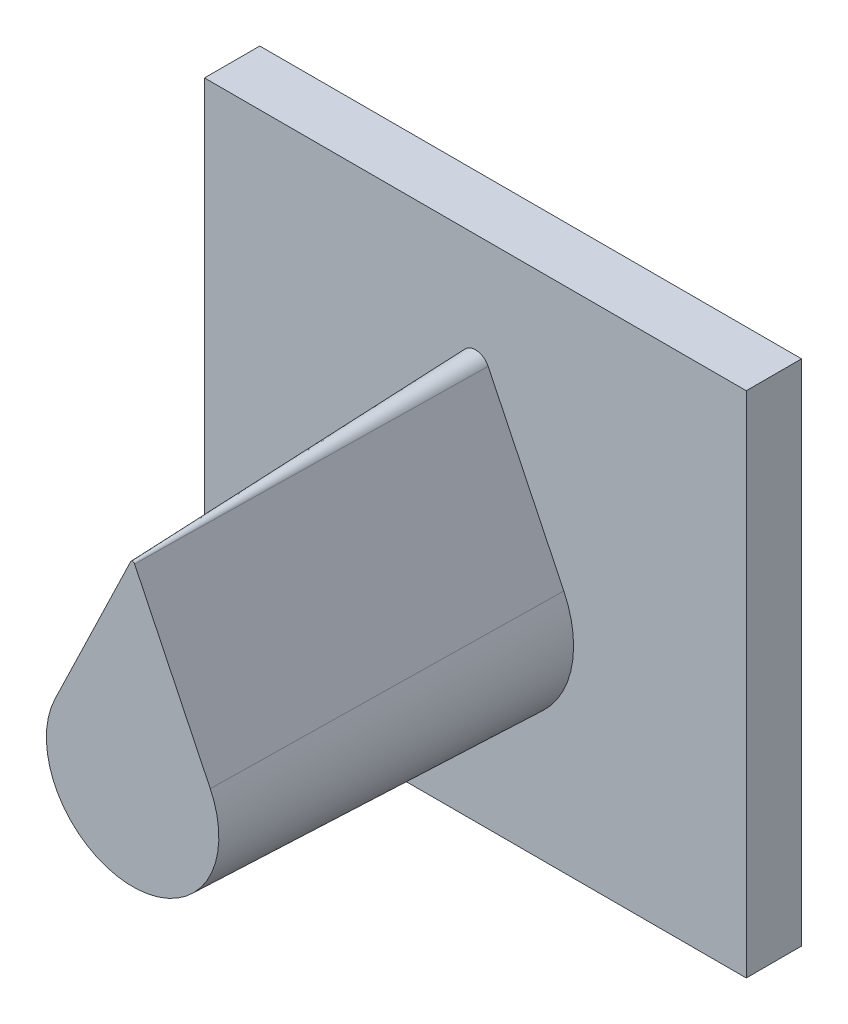
ISO-10303-21;
HEADER;
FILE_DESCRIPTION(('STEP AP214'),'2;1');
FILE_NAME('part.step','',(''),(''),'','','');
FILE_SCHEMA(('AUTOMOTIVE_DESIGN { 1 0 10303 214 1 1 1 1 }'));
ENDSEC;
DATA;
#1=APPLICATION_CONTEXT('core data for automotive mechanical design processes');
#2=APPLICATION_PROTOCOL_DEFINITION('international standard','automotive_design',2000,#1);
#3=PRODUCT_CONTEXT('',#1,'mechanical');
#4=PRODUCT('Part','Part','',(#3));
#5=PRODUCT_RELATED_PRODUCT_CATEGORY('part','',(#4));
#6=PRODUCT_DEFINITION_FORMATION('','',#4);
#7=PRODUCT_DEFINITION_CONTEXT('part definition',#1,'design');
#8=PRODUCT_DEFINITION('design','',#6,#7);
#9=PRODUCT_DEFINITION_SHAPE('','',#8);
#10=(LENGTH_UNIT() NAMED_UNIT(*) SI_UNIT(.MILLI.,.METRE.));
#11=(NAMED_UNIT(*) PLANE_ANGLE_UNIT() SI_UNIT($,.RADIAN.));
#12=(NAMED_UNIT(*) SI_UNIT($,.STERADIAN.) SOLID_ANGLE_UNIT());
#13=UNCERTAINTY_MEASURE_WITH_UNIT(LENGTH_MEASURE(1.E-05),#10,'distance_accuracy_value','');
#14=(GEOMETRIC_REPRESENTATION_CONTEXT(3) GLOBAL_UNCERTAINTY_ASSIGNED_CONTEXT((#13)) GLOBAL_UNIT_ASSIGNED_CONTEXT((#10,
#11,#12)) REPRESENTATION_CONTEXT('',''));
#15=CARTESIAN_POINT('',(0.,0.,0.));
#16=DIRECTION('',(0.,0.,1.));
#17=DIRECTION('',(1.,0.,0.));
#18=AXIS2_PLACEMENT_3D('',#15,#16,#17);
#19=CARTESIAN_POINT('',(0.,3.17,1.70530256582424E-10));
#20=DIRECTION('',(0.,0.,-1.));
#21=DIRECTION('',(-1.,0.,0.));
#22=AXIS2_PLACEMENT_3D('',#19,#20,#21);
#23=CONICAL_SURFACE('',#22,0.320605486340497,0.0349065850402135);
#24=CARTESIAN_POINT('',(0.,3.17,0.));
#25=DIRECTION('',(0.,0.,-1.));
#26=DIRECTION('',(-1.,0.,0.));
#27=AXIS2_PLACEMENT_3D('',#24,#25,#26);
#28=CIRCLE('',#27,0.320605486346452);
#29=CARTESIAN_POINT('',(0.288716603510547,3.3093936897157,0.));
#30=VERTEX_POINT('',#29);
#31=CARTESIAN_POINT('',(-0.288716603510547,3.3093936897157,0.));
#32=VERTEX_POINT('',#31);
#33=EDGE_CURVE('E20',#30,#32,#28,.F.);
#34=ORIENTED_EDGE('',*,*,#33,.T.);
#35=DIRECTION('',(0.0314282337055708,-0.0151736942184786,0.999390827019096));
#36=VECTOR('',#35,1.);
#37=CARTESIAN_POINT('',(-0.0450542012173647,3.19175237332567,7.74825502516488));
#38=LINE('',#37,#36);
#39=CARTESIAN_POINT('',(-0.0449993263123269,3.19172587947186,7.74999999999363));
#40=VERTEX_POINT('',#39);
#41=EDGE_CURVE('E84',#40,#32,#38,.F.);
#42=ORIENTED_EDGE('',*,*,#41,.F.);
#43=CARTESIAN_POINT('',(0.,3.17,7.74999999998727));
#44=DIRECTION('',(0.,0.,-1.));
#45=DIRECTION('',(-1.,0.,0.));
#46=AXIS2_PLACEMENT_3D('',#43,#44,#45);
#47=CIRCLE('',#46,0.0499695227833149);
#48=CARTESIAN_POINT('',(0.0449993263123238,3.19172587947186,7.74999999999363));
#49=VERTEX_POINT('',#48);
#50=EDGE_CURVE('E89',#49,#40,#47,.F.);
#51=ORIENTED_EDGE('',*,*,#50,.F.);
#52=DIRECTION('',(-0.0314282337055708,-0.0151736942184786,0.999390827019096));
#53=VECTOR('',#52,1.);
#54=CARTESIAN_POINT('',(0.0450542012173617,3.19175237332567,7.74825502516488));
#55=LINE('',#54,#53);
#56=EDGE_CURVE('E87',#30,#49,#55,.T.);
#57=ORIENTED_EDGE('',*,*,#56,.F.);
#58=EDGE_LOOP('',(#34,#42,#51,#57));
#59=FACE_BOUND('',#58,.T.);
#60=ADVANCED_FACE('F17',(#59),#23,.T.);
#61=CARTESIAN_POINT('',(0.,0.,7.75));
#62=DIRECTION('',(0.,0.,1.));
#63=DIRECTION('',(1.,0.,0.));
#64=AXIS2_PLACEMENT_3D('',#61,#62,#63);
#65=PLANE('',#64);
#66=DIRECTION('',(-0.434782608695651,0.900535442487304,0.));
#67=VECTOR('',#66,1.);
#68=CARTESIAN_POINT('',(1.28617208834897,0.620969735804466,7.75));
#69=LINE('',#68,#67);
#70=CARTESIAN_POINT('',(1.75601666703701,-0.352187164006796,7.75000000000466));
#71=VERTEX_POINT('',#70);
#72=EDGE_CURVE('E116',#49,#71,#69,.F.);
#73=ORIENTED_EDGE('',*,*,#72,.F.);
#74=ORIENTED_EDGE('',*,*,#50,.T.);
#75=DIRECTION('',(-0.434782608695651,-0.900535442487304,0.));
#76=VECTOR('',#75,1.);
#77=CARTESIAN_POINT('',(-1.28617208834897,0.620969735804466,7.75));
#78=LINE('',#77,#76);
#79=CARTESIAN_POINT('',(-1.75601666703692,-0.352187164006386,7.75000000000466));
#80=VERTEX_POINT('',#79);
#81=EDGE_CURVE('E95',#80,#40,#78,.F.);
#82=ORIENTED_EDGE('',*,*,#81,.F.);
#83=CARTESIAN_POINT('',(0.,-1.2,7.74999999998727));
#84=DIRECTION('',(0.,0.,-1.));
#85=DIRECTION('',(-1.,0.,0.));
#86=AXIS2_PLACEMENT_3D('',#83,#84,#85);
#87=CIRCLE('',#86,1.94996952278558);
#88=EDGE_CURVE('E96',#71,#80,#87,.T.);
#89=ORIENTED_EDGE('',*,*,#88,.F.);
#90=EDGE_LOOP('',(#73,#74,#82,#89));
#91=FACE_BOUND('',#90,.T.);
#92=ADVANCED_FACE('F123',(#91),#65,.T.);
#93=CARTESIAN_POINT('',(1.28622696325421,0.620996229658373,7.74825502516488));
#94=DIRECTION('',(0.899986860627394,0.434517750877867,0.0348994967025009));
#95=DIRECTION('',(-0.434782608695651,0.900535442487304,0.));
#96=AXIS2_PLACEMENT_3D('',#93,#94,#95);
#97=PLANE('',#96);
#98=DIRECTION('',(-0.031428233705571,-0.0151736942184786,0.999390827019096));
#99=VECTOR('',#98,1.);
#100=CARTESIAN_POINT('',(15694.2476464621,7576.05416602971,-499000.));
#101=LINE('',#100,#99);
#102=CARTESIAN_POINT('',(1.99973394423506,-0.234519353762834,2.8421709430404E-11));
#103=VERTEX_POINT('',#102);
#104=EDGE_CURVE('E106',#103,#71,#101,.T.);
#105=ORIENTED_EDGE('',*,*,#104,.F.);
#106=DIRECTION('',(-0.434782608695653,0.900535442487303,0.));
#107=VECTOR('',#106,1.);
#108=CARTESIAN_POINT('',(1.99973394423643,-0.234519353762568,0.));
#109=LINE('',#108,#107);
#110=EDGE_CURVE('E102',#103,#30,#109,.T.);
#111=ORIENTED_EDGE('',*,*,#110,.T.);
#112=ORIENTED_EDGE('',*,*,#56,.T.);
#113=ORIENTED_EDGE('',*,*,#72,.T.);
#114=EDGE_LOOP('',(#105,#111,#112,#113));
#115=FACE_BOUND('',#114,.T.);
#116=ADVANCED_FACE('F125',(#115),#97,.T.);
#117=CARTESIAN_POINT('',(-1.28622696325421,0.620996229658373,7.74825502516488));
#118=DIRECTION('',(-0.899986860627394,0.434517750877867,0.0348994967025009));
#119=DIRECTION('',(-0.434782608695651,-0.900535442487304,0.));
#120=AXIS2_PLACEMENT_3D('',#117,#118,#119);
#121=PLANE('',#120);
#122=ORIENTED_EDGE('',*,*,#41,.T.);
#123=DIRECTION('',(-0.434782608695653,-0.900535442487303,0.));
#124=VECTOR('',#123,1.);
#125=CARTESIAN_POINT('',(-0.288716603510545,3.3093936897157,0.));
#126=LINE('',#125,#124);
#127=CARTESIAN_POINT('',(-1.99973394423547,-0.234519353762542,1.4210854715202E-11));
#128=VERTEX_POINT('',#127);
#129=EDGE_CURVE('E93',#32,#128,#126,.T.);
#130=ORIENTED_EDGE('',*,*,#129,.T.);
#131=DIRECTION('',(0.0314282337055709,-0.0151736942184786,0.999390827019096));
#132=VECTOR('',#131,1.);
#133=CARTESIAN_POINT('',(-15694.2476464621,7576.05416602974,-499000.));
#134=LINE('',#133,#132);
#135=EDGE_CURVE('E111',#80,#128,#134,.F.);
#136=ORIENTED_EDGE('',*,*,#135,.F.);
#137=ORIENTED_EDGE('',*,*,#81,.T.);
#138=EDGE_LOOP('',(#122,#130,#136,#137));
#139=FACE_BOUND('',#138,.T.);
#140=ADVANCED_FACE('F91',(#139),#121,.T.);
#141=CARTESIAN_POINT('',(0.,-1.2,5.6843418860808E-11));
#142=DIRECTION('',(0.,0.,-1.));
#143=DIRECTION('',(-1.,0.,0.));
#144=AXIS2_PLACEMENT_3D('',#141,#142,#143);
#145=CONICAL_SURFACE('',#144,2.22060548634318,0.0349065850397557);
#146=CARTESIAN_POINT('',(0.,-1.2,0.));
#147=DIRECTION('',(0.,0.,-1.));
#148=DIRECTION('',(-1.,0.,0.));
#149=AXIS2_PLACEMENT_3D('',#146,#147,#148);
#150=CIRCLE('',#149,2.22060548634516);
#151=EDGE_CURVE('E101',#128,#103,#150,.F.);
#152=ORIENTED_EDGE('',*,*,#151,.T.);
#153=ORIENTED_EDGE('',*,*,#104,.T.);
#154=ORIENTED_EDGE('',*,*,#88,.T.);
#155=ORIENTED_EDGE('',*,*,#135,.T.);
#156=EDGE_LOOP('',(#152,#153,#154,#155));
#157=FACE_BOUND('',#156,.T.);
#158=ADVANCED_FACE('F127',(#157),#145,.T.);
#159=CARTESIAN_POINT('',(0.,0.,0.));
#160=DIRECTION('',(0.,0.,-1.));
#161=DIRECTION('',(-1.,0.,0.));
#162=AXIS2_PLACEMENT_3D('',#159,#160,#161);
#163=PLANE('',#162);
#164=DIRECTION('',(0.,1.,0.));
#165=VECTOR('',#164,1.);
#166=CARTESIAN_POINT('',(-6.125,0.,0.));
#167=LINE('',#166,#165);
#168=CARTESIAN_POINT('',(-6.125,5.75,0.));
#169=VERTEX_POINT('',#168);
#170=CARTESIAN_POINT('',(-6.125,-5.75,0.));
#171=VERTEX_POINT('',#170);
#172=EDGE_CURVE('E176',#169,#171,#167,.F.);
#173=ORIENTED_EDGE('',*,*,#172,.T.);
#174=DIRECTION('',(1.,0.,0.));
#175=VECTOR('',#174,1.);
#176=CARTESIAN_POINT('',(0.,-5.75,0.));
#177=LINE('',#176,#175);
#178=CARTESIAN_POINT('',(6.125,-5.75,0.));
#179=VERTEX_POINT('',#178);
#180=EDGE_CURVE('E185',#171,#179,#177,.T.);
#181=ORIENTED_EDGE('',*,*,#180,.T.);
#182=DIRECTION('',(0.,-1.,0.));
#183=VECTOR('',#182,1.);
#184=CARTESIAN_POINT('',(6.125,0.,0.));
#185=LINE('',#184,#183);
#186=CARTESIAN_POINT('',(6.125,5.75,0.));
#187=VERTEX_POINT('',#186);
#188=EDGE_CURVE('E170',#179,#187,#185,.F.);
#189=ORIENTED_EDGE('',*,*,#188,.T.);
#190=DIRECTION('',(1.,0.,0.));
#191=VECTOR('',#190,1.);
#192=CARTESIAN_POINT('',(0.,5.75,0.));
#193=LINE('',#192,#191);
#194=EDGE_CURVE('E104',#187,#169,#193,.F.);
#195=ORIENTED_EDGE('',*,*,#194,.T.);
#196=EDGE_LOOP('',(#173,#181,#189,#195));
#197=FACE_BOUND('',#196,.T.);
#198=ORIENTED_EDGE('',*,*,#129,.F.);
#199=ORIENTED_EDGE('',*,*,#33,.F.);
#200=ORIENTED_EDGE('',*,*,#110,.F.);
#201=ORIENTED_EDGE('',*,*,#151,.F.);
#202=EDGE_LOOP('',(#198,#199,#200,#201));
#203=FACE_BOUND('',#202,.T.);
#204=ADVANCED_FACE('F99',(#197,#203),#163,.F.);
#205=CARTESIAN_POINT('',(0.,5.75,-1.25));
#206=DIRECTION('',(0.,-1.,0.));
#207=DIRECTION('',(0.,0.,-1.));
#208=AXIS2_PLACEMENT_3D('',#205,#206,#207);
#209=PLANE('',#208);
#210=DIRECTION('',(0.,0.,1.));
#211=VECTOR('',#210,1.);
#212=CARTESIAN_POINT('',(6.125,5.75,-1.25));
#213=LINE('',#212,#211);
#214=CARTESIAN_POINT('',(6.125,5.75,-1.25));
#215=VERTEX_POINT('',#214);
#216=EDGE_CURVE('E163',#187,#215,#213,.F.);
#217=ORIENTED_EDGE('',*,*,#216,.T.);
#218=DIRECTION('',(-1.,0.,0.));
#219=VECTOR('',#218,1.);
#220=CARTESIAN_POINT('',(0.,5.75,-1.25));
#221=LINE('',#220,#219);
#222=CARTESIAN_POINT('',(-6.125,5.75,-1.25));
#223=VERTEX_POINT('',#222);
#224=EDGE_CURVE('E167',#223,#215,#221,.F.);
#225=ORIENTED_EDGE('',*,*,#224,.F.);
#226=DIRECTION('',(0.,0.,1.));
#227=VECTOR('',#226,1.);
#228=CARTESIAN_POINT('',(-6.125,5.75,-1.25));
#229=LINE('',#228,#227);
#230=EDGE_CURVE('E179',#223,#169,#229,.T.);
#231=ORIENTED_EDGE('',*,*,#230,.T.);
#232=ORIENTED_EDGE('',*,*,#194,.F.);
#233=EDGE_LOOP('',(#217,#225,#231,#232));
#234=FACE_BOUND('',#233,.T.);
#235=ADVANCED_FACE('F135',(#234),#209,.F.);
#236=CARTESIAN_POINT('',(6.125,0.,-1.25));
#237=DIRECTION('',(-1.,0.,0.));
#238=DIRECTION('',(0.,-1.,0.));
#239=AXIS2_PLACEMENT_3D('',#236,#237,#238);
#240=PLANE('',#239);
#241=DIRECTION('',(0.,0.,1.));
#242=VECTOR('',#241,1.);
#243=CARTESIAN_POINT('',(6.125,-5.75,-1.25));
#244=LINE('',#243,#242);
#245=CARTESIAN_POINT('',(6.125,-5.75,-1.25));
#246=VERTEX_POINT('',#245);
#247=EDGE_CURVE('E174',#179,#246,#244,.F.);
#248=ORIENTED_EDGE('',*,*,#247,.T.);
#249=DIRECTION('',(0.,1.,0.));
#250=VECTOR('',#249,1.);
#251=CARTESIAN_POINT('',(6.125,0.,-1.25));
#252=LINE('',#251,#250);
#253=EDGE_CURVE('E172',#215,#246,#252,.F.);
#254=ORIENTED_EDGE('',*,*,#253,.F.);
#255=ORIENTED_EDGE('',*,*,#216,.F.);
#256=ORIENTED_EDGE('',*,*,#188,.F.);
#257=EDGE_LOOP('',(#248,#254,#255,#256));
#258=FACE_BOUND('',#257,.T.);
#259=ADVANCED_FACE('F154',(#258),#240,.F.);
#260=CARTESIAN_POINT('',(0.,-5.75,-1.25));
#261=DIRECTION('',(0.,1.,0.));
#262=DIRECTION('',(0.,0.,1.));
#263=AXIS2_PLACEMENT_3D('',#260,#261,#262);
#264=PLANE('',#263);
#265=DIRECTION('',(0.,0.,1.));
#266=VECTOR('',#265,1.);
#267=CARTESIAN_POINT('',(-6.125,-5.75,-1.25));
#268=LINE('',#267,#266);
#269=CARTESIAN_POINT('',(-6.125,-5.75,-1.25));
#270=VERTEX_POINT('',#269);
#271=EDGE_CURVE('E35',#171,#270,#268,.F.);
#272=ORIENTED_EDGE('',*,*,#271,.T.);
#273=DIRECTION('',(-1.,0.,0.));
#274=VECTOR('',#273,1.);
#275=CARTESIAN_POINT('',(0.,-5.75,-1.25));
#276=LINE('',#275,#274);
#277=EDGE_CURVE('E26',#246,#270,#276,.T.);
#278=ORIENTED_EDGE('',*,*,#277,.F.);
#279=ORIENTED_EDGE('',*,*,#247,.F.);
#280=ORIENTED_EDGE('',*,*,#180,.F.);
#281=EDGE_LOOP('',(#272,#278,#279,#280));
#282=FACE_BOUND('',#281,.T.);
#283=ADVANCED_FACE('F147',(#282),#264,.F.);
#284=CARTESIAN_POINT('',(-6.125,0.,-1.25));
#285=DIRECTION('',(1.,0.,0.));
#286=DIRECTION('',(0.,1.,0.));
#287=AXIS2_PLACEMENT_3D('',#284,#285,#286);
#288=PLANE('',#287);
#289=ORIENTED_EDGE('',*,*,#230,.F.);
#290=DIRECTION('',(0.,1.,0.));
#291=VECTOR('',#290,1.);
#292=CARTESIAN_POINT('',(-6.125,0.,-1.25));
#293=LINE('',#292,#291);
#294=EDGE_CURVE('E11',#270,#223,#293,.T.);
#295=ORIENTED_EDGE('',*,*,#294,.F.);
#296=ORIENTED_EDGE('',*,*,#271,.F.);
#297=ORIENTED_EDGE('',*,*,#172,.F.);
#298=EDGE_LOOP('',(#289,#295,#296,#297));
#299=FACE_BOUND('',#298,.T.);
#300=ADVANCED_FACE('F141',(#299),#288,.F.);
#301=CARTESIAN_POINT('',(0.,0.,-1.25));
#302=DIRECTION('',(0.,0.,-1.));
#303=DIRECTION('',(-1.,0.,0.));
#304=AXIS2_PLACEMENT_3D('',#301,#302,#303);
#305=PLANE('',#304);
#306=ORIENTED_EDGE('',*,*,#277,.T.);
#307=ORIENTED_EDGE('',*,*,#294,.T.);
#308=ORIENTED_EDGE('',*,*,#224,.T.);
#309=ORIENTED_EDGE('',*,*,#253,.T.);
#310=EDGE_LOOP('',(#306,#307,#308,#309));
#311=FACE_BOUND('',#310,.T.);
#312=ADVANCED_FACE('F139',(#311),#305,.T.);
#313=CLOSED_SHELL('',(#60,#92,#116,#140,#158,#204,#235,#259,#283,#300,#312));
#314=MANIFOLD_SOLID_BREP('B1',#313);
#315=ADVANCED_BREP_SHAPE_REPRESENTATION('',(#18,#314),#14);
#316=SHAPE_DEFINITION_REPRESENTATION(#9,#315);
ENDSEC;
END-ISO-10303-21;
